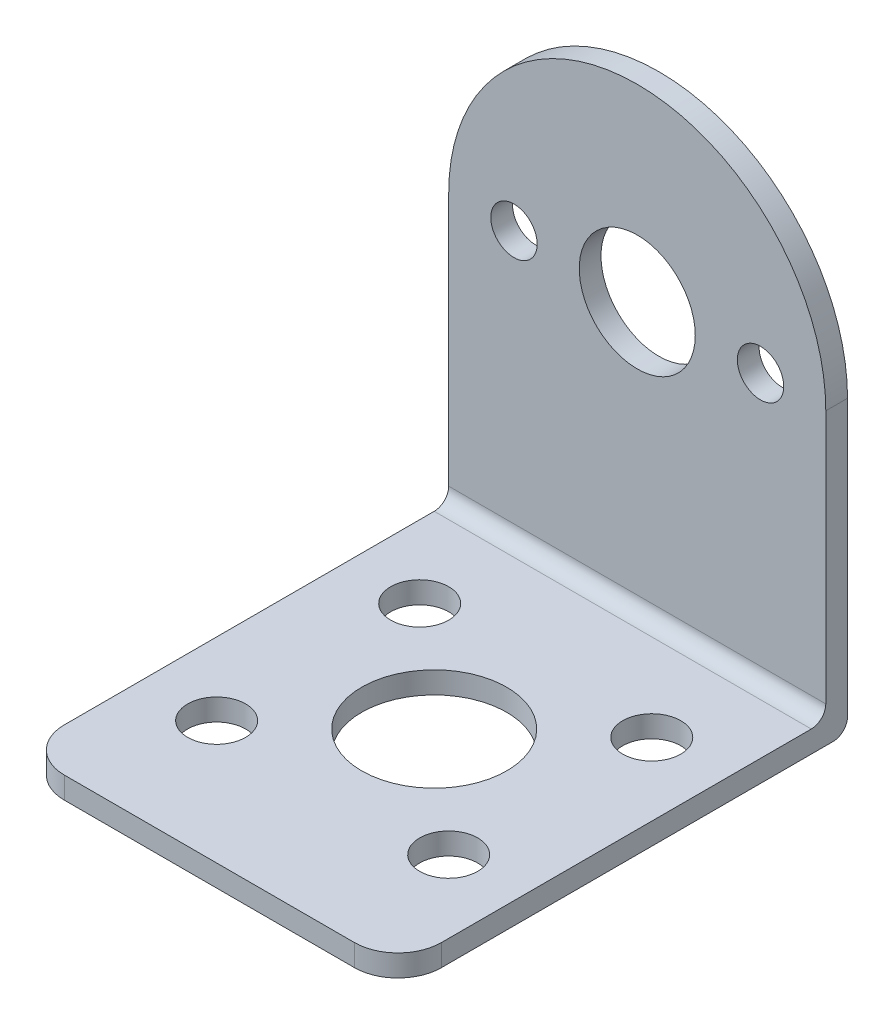
ISO-10303-21;
HEADER;
FILE_DESCRIPTION(('STEP AP214'),'2;1');
FILE_NAME('part.step','',(''),(''),'','','');
FILE_SCHEMA(('AUTOMOTIVE_DESIGN { 1 0 10303 214 1 1 1 1 }'));
ENDSEC;
DATA;
#1=APPLICATION_CONTEXT('core data for automotive mechanical design processes');
#2=APPLICATION_PROTOCOL_DEFINITION('international standard','automotive_design',2000,#1);
#3=PRODUCT_CONTEXT('',#1,'mechanical');
#4=PRODUCT('Part','Part','',(#3));
#5=PRODUCT_RELATED_PRODUCT_CATEGORY('part','',(#4));
#6=PRODUCT_DEFINITION_FORMATION('','',#4);
#7=PRODUCT_DEFINITION_CONTEXT('part definition',#1,'design');
#8=PRODUCT_DEFINITION('design','',#6,#7);
#9=PRODUCT_DEFINITION_SHAPE('','',#8);
#10=(LENGTH_UNIT() NAMED_UNIT(*) SI_UNIT(.MILLI.,.METRE.));
#11=(NAMED_UNIT(*) PLANE_ANGLE_UNIT() SI_UNIT($,.RADIAN.));
#12=(NAMED_UNIT(*) SI_UNIT($,.STERADIAN.) SOLID_ANGLE_UNIT());
#13=UNCERTAINTY_MEASURE_WITH_UNIT(LENGTH_MEASURE(1.E-05),#10,'distance_accuracy_value','');
#14=(GEOMETRIC_REPRESENTATION_CONTEXT(3) GLOBAL_UNCERTAINTY_ASSIGNED_CONTEXT((#13)) GLOBAL_UNIT_ASSIGNED_CONTEXT((#10,
#11,#12)) REPRESENTATION_CONTEXT('',''));
#15=CARTESIAN_POINT('',(0.,0.,0.));
#16=DIRECTION('',(0.,0.,1.));
#17=DIRECTION('',(1.,0.,0.));
#18=AXIS2_PLACEMENT_3D('',#15,#16,#17);
#19=CARTESIAN_POINT('',(-13.,1.5,-15.5));
#20=DIRECTION('',(0.,0.,1.));
#21=DIRECTION('',(1.,0.,0.));
#22=AXIS2_PLACEMENT_3D('',#19,#20,#21);
#23=PLANE('',#22);
#24=CARTESIAN_POINT('',(8.5,20.,-15.5));
#25=DIRECTION('',(0.,0.,1.));
#26=DIRECTION('',(1.,0.,0.));
#27=AXIS2_PLACEMENT_3D('',#24,#25,#26);
#28=CIRCLE('',#27,1.6);
#29=CARTESIAN_POINT('',(10.1,20.,-15.5));
#30=VERTEX_POINT('',#29);
#31=EDGE_CURVE('E311',#30,#30,#28,.T.);
#32=ORIENTED_EDGE('',*,*,#31,.T.);
#33=EDGE_LOOP('',(#32));
#34=FACE_BOUND('',#33,.T.);
#35=CARTESIAN_POINT('',(0.,20.,-15.5));
#36=DIRECTION('',(0.,0.,1.));
#37=DIRECTION('',(1.,0.,0.));
#38=AXIS2_PLACEMENT_3D('',#35,#36,#37);
#39=CIRCLE('',#38,4.);
#40=CARTESIAN_POINT('',(4.,20.,-15.5));
#41=VERTEX_POINT('',#40);
#42=EDGE_CURVE('E305',#41,#41,#39,.T.);
#43=ORIENTED_EDGE('',*,*,#42,.T.);
#44=EDGE_LOOP('',(#43));
#45=FACE_BOUND('',#44,.T.);
#46=DIRECTION('',(0.,-1.,0.));
#47=VECTOR('',#46,1.);
#48=CARTESIAN_POINT('',(13.,1.5,-15.5));
#49=LINE('',#48,#47);
#50=CARTESIAN_POINT('',(13.,20.,-15.5));
#51=VERTEX_POINT('',#50);
#52=CARTESIAN_POINT('',(13.,1.,-15.5));
#53=VERTEX_POINT('',#52);
#54=EDGE_CURVE('E183',#51,#53,#49,.T.);
#55=ORIENTED_EDGE('',*,*,#54,.T.);
#56=DIRECTION('',(-1.,0.,0.));
#57=VECTOR('',#56,1.);
#58=CARTESIAN_POINT('',(-13.,1.,-15.5));
#59=LINE('',#58,#57);
#60=CARTESIAN_POINT('',(-13.,1.,-15.5));
#61=VERTEX_POINT('',#60);
#62=EDGE_CURVE('E205',#53,#61,#59,.T.);
#63=ORIENTED_EDGE('',*,*,#62,.T.);
#64=DIRECTION('',(0.,-1.,0.));
#65=VECTOR('',#64,1.);
#66=CARTESIAN_POINT('',(-13.,1.5,-15.5));
#67=LINE('',#66,#65);
#68=CARTESIAN_POINT('',(-13.,20.,-15.5));
#69=VERTEX_POINT('',#68);
#70=EDGE_CURVE('E186',#69,#61,#67,.T.);
#71=ORIENTED_EDGE('',*,*,#70,.F.);
#72=CARTESIAN_POINT('',(0.,20.,-15.5));
#73=DIRECTION('',(0.,0.,1.));
#74=DIRECTION('',(1.,0.,0.));
#75=AXIS2_PLACEMENT_3D('',#72,#73,#74);
#76=CIRCLE('',#75,13.);
#77=EDGE_CURVE('E178',#51,#69,#76,.T.);
#78=ORIENTED_EDGE('',*,*,#77,.F.);
#79=EDGE_LOOP('',(#55,#63,#71,#78));
#80=FACE_BOUND('',#79,.T.);
#81=CARTESIAN_POINT('',(-8.5,20.,-15.5));
#82=DIRECTION('',(0.,0.,1.));
#83=DIRECTION('',(1.,0.,0.));
#84=AXIS2_PLACEMENT_3D('',#81,#82,#83);
#85=CIRCLE('',#84,1.6);
#86=CARTESIAN_POINT('',(-6.9,20.,-15.5));
#87=VERTEX_POINT('',#86);
#88=EDGE_CURVE('E199',#87,#87,#85,.F.);
#89=ORIENTED_EDGE('',*,*,#88,.F.);
#90=EDGE_LOOP('',(#89));
#91=FACE_BOUND('',#90,.T.);
#92=ADVANCED_FACE('F99',(#34,#45,#80,#91),#23,.F.);
#93=CARTESIAN_POINT('',(-13.,33.,-14.));
#94=DIRECTION('',(0.,0.,-1.));
#95=DIRECTION('',(-1.,0.,0.));
#96=AXIS2_PLACEMENT_3D('',#93,#94,#95);
#97=PLANE('',#96);
#98=CARTESIAN_POINT('',(8.5,20.,-14.));
#99=DIRECTION('',(0.,0.,1.));
#100=DIRECTION('',(1.,0.,0.));
#101=AXIS2_PLACEMENT_3D('',#98,#99,#100);
#102=CIRCLE('',#101,1.6);
#103=CARTESIAN_POINT('',(10.1,20.,-14.));
#104=VERTEX_POINT('',#103);
#105=EDGE_CURVE('E308',#104,#104,#102,.T.);
#106=ORIENTED_EDGE('',*,*,#105,.F.);
#107=EDGE_LOOP('',(#106));
#108=FACE_BOUND('',#107,.T.);
#109=CARTESIAN_POINT('',(0.,20.,-14.));
#110=DIRECTION('',(0.,0.,1.));
#111=DIRECTION('',(1.,0.,0.));
#112=AXIS2_PLACEMENT_3D('',#109,#110,#111);
#113=CIRCLE('',#112,4.);
#114=CARTESIAN_POINT('',(4.,20.,-14.));
#115=VERTEX_POINT('',#114);
#116=EDGE_CURVE('E314',#115,#115,#113,.T.);
#117=ORIENTED_EDGE('',*,*,#116,.F.);
#118=EDGE_LOOP('',(#117));
#119=FACE_BOUND('',#118,.T.);
#120=DIRECTION('',(0.,-1.,0.));
#121=VECTOR('',#120,1.);
#122=CARTESIAN_POINT('',(-13.,33.,-14.));
#123=LINE('',#122,#121);
#124=CARTESIAN_POINT('',(-13.,20.,-14.));
#125=VERTEX_POINT('',#124);
#126=CARTESIAN_POINT('',(-13.,2.5,-14.));
#127=VERTEX_POINT('',#126);
#128=EDGE_CURVE('E293',#125,#127,#123,.T.);
#129=ORIENTED_EDGE('',*,*,#128,.T.);
#130=DIRECTION('',(1.,0.,0.));
#131=VECTOR('',#130,1.);
#132=CARTESIAN_POINT('',(13.,2.5,-14.));
#133=LINE('',#132,#131);
#134=CARTESIAN_POINT('',(13.,2.5,-14.));
#135=VERTEX_POINT('',#134);
#136=EDGE_CURVE('E218',#127,#135,#133,.T.);
#137=ORIENTED_EDGE('',*,*,#136,.T.);
#138=DIRECTION('',(0.,-1.,0.));
#139=VECTOR('',#138,1.);
#140=CARTESIAN_POINT('',(13.,33.,-14.));
#141=LINE('',#140,#139);
#142=CARTESIAN_POINT('',(13.,20.,-14.));
#143=VERTEX_POINT('',#142);
#144=EDGE_CURVE('E298',#143,#135,#141,.T.);
#145=ORIENTED_EDGE('',*,*,#144,.F.);
#146=CARTESIAN_POINT('',(0.,20.,-14.));
#147=DIRECTION('',(0.,0.,1.));
#148=DIRECTION('',(1.,0.,0.));
#149=AXIS2_PLACEMENT_3D('',#146,#147,#148);
#150=CIRCLE('',#149,13.);
#151=EDGE_CURVE('E190',#143,#125,#150,.T.);
#152=ORIENTED_EDGE('',*,*,#151,.T.);
#153=EDGE_LOOP('',(#129,#137,#145,#152));
#154=FACE_BOUND('',#153,.T.);
#155=CARTESIAN_POINT('',(-8.5,20.,-14.));
#156=DIRECTION('',(0.,0.,1.));
#157=DIRECTION('',(1.,0.,0.));
#158=AXIS2_PLACEMENT_3D('',#155,#156,#157);
#159=CIRCLE('',#158,1.6);
#160=CARTESIAN_POINT('',(-6.9,20.,-14.));
#161=VERTEX_POINT('',#160);
#162=EDGE_CURVE('E302',#161,#161,#159,.F.);
#163=ORIENTED_EDGE('',*,*,#162,.T.);
#164=EDGE_LOOP('',(#163));
#165=FACE_BOUND('',#164,.T.);
#166=ADVANCED_FACE('F329',(#108,#119,#154,#165),#97,.F.);
#167=CARTESIAN_POINT('',(-13.,1.5,15.5));
#168=DIRECTION('',(1.,0.,0.));
#169=DIRECTION('',(0.,0.,-1.));
#170=AXIS2_PLACEMENT_3D('',#167,#168,#169);
#171=PLANE('',#170);
#172=DIRECTION('',(0.,0.,1.));
#173=VECTOR('',#172,1.);
#174=CARTESIAN_POINT('',(-13.,0.,15.5));
#175=LINE('',#174,#173);
#176=CARTESIAN_POINT('',(-13.,0.,-14.5));
#177=VERTEX_POINT('',#176);
#178=CARTESIAN_POINT('',(-13.,0.,12.5));
#179=VERTEX_POINT('',#178);
#180=EDGE_CURVE('E259',#177,#179,#175,.T.);
#181=ORIENTED_EDGE('',*,*,#180,.T.);
#182=DIRECTION('',(0.,-1.,0.));
#183=VECTOR('',#182,1.);
#184=CARTESIAN_POINT('',(-13.,1.5,12.5));
#185=LINE('',#184,#183);
#186=CARTESIAN_POINT('',(-13.,1.5,12.5));
#187=VERTEX_POINT('',#186);
#188=EDGE_CURVE('E12',#179,#187,#185,.F.);
#189=ORIENTED_EDGE('',*,*,#188,.T.);
#190=DIRECTION('',(0.,0.,1.));
#191=VECTOR('',#190,1.);
#192=CARTESIAN_POINT('',(-13.,1.5,15.5));
#193=LINE('',#192,#191);
#194=CARTESIAN_POINT('',(-13.,1.5,-13.));
#195=VERTEX_POINT('',#194);
#196=EDGE_CURVE('E248',#195,#187,#193,.T.);
#197=ORIENTED_EDGE('',*,*,#196,.F.);
#198=CARTESIAN_POINT('',(-13.,2.5,-13.));
#199=DIRECTION('',(1.,0.,0.));
#200=DIRECTION('',(0.,0.,-1.));
#201=AXIS2_PLACEMENT_3D('',#198,#199,#200);
#202=CIRCLE('',#201,1.);
#203=EDGE_CURVE('E226',#195,#127,#202,.T.);
#204=ORIENTED_EDGE('',*,*,#203,.T.);
#205=ORIENTED_EDGE('',*,*,#128,.F.);
#206=DIRECTION('',(0.,0.,1.));
#207=VECTOR('',#206,1.);
#208=CARTESIAN_POINT('',(-13.,20.,-15.5));
#209=LINE('',#208,#207);
#210=EDGE_CURVE('E189',#69,#125,#209,.T.);
#211=ORIENTED_EDGE('',*,*,#210,.F.);
#212=ORIENTED_EDGE('',*,*,#70,.T.);
#213=CARTESIAN_POINT('',(-13.,1.,-14.5));
#214=DIRECTION('',(1.,0.,0.));
#215=DIRECTION('',(0.,0.,-1.));
#216=AXIS2_PLACEMENT_3D('',#213,#214,#215);
#217=CIRCLE('',#216,1.);
#218=EDGE_CURVE('E207',#61,#177,#217,.F.);
#219=ORIENTED_EDGE('',*,*,#218,.T.);
#220=EDGE_LOOP('',(#181,#189,#197,#204,#205,#211,#212,#219));
#221=FACE_BOUND('',#220,.T.);
#222=ADVANCED_FACE('F332',(#221),#171,.F.);
#223=CARTESIAN_POINT('',(0.,1.5,0.));
#224=DIRECTION('',(0.,-1.,0.));
#225=DIRECTION('',(0.,0.,-1.));
#226=AXIS2_PLACEMENT_3D('',#223,#224,#225);
#227=PLANE('',#226);
#228=CARTESIAN_POINT('',(8.,1.5,7.));
#229=DIRECTION('',(0.,1.,0.));
#230=DIRECTION('',(0.,0.,1.));
#231=AXIS2_PLACEMENT_3D('',#228,#229,#230);
#232=CIRCLE('',#231,2.);
#233=CARTESIAN_POINT('',(8.,1.5,9.));
#234=VERTEX_POINT('',#233);
#235=EDGE_CURVE('E287',#234,#234,#232,.T.);
#236=ORIENTED_EDGE('',*,*,#235,.F.);
#237=EDGE_LOOP('',(#236));
#238=FACE_BOUND('',#237,.T.);
#239=CARTESIAN_POINT('',(8.,1.5,-7.));
#240=DIRECTION('',(0.,1.,0.));
#241=DIRECTION('',(0.,0.,1.));
#242=AXIS2_PLACEMENT_3D('',#239,#240,#241);
#243=CIRCLE('',#242,2.);
#244=CARTESIAN_POINT('',(8.,1.5,-5.));
#245=VERTEX_POINT('',#244);
#246=EDGE_CURVE('E281',#245,#245,#243,.T.);
#247=ORIENTED_EDGE('',*,*,#246,.F.);
#248=EDGE_LOOP('',(#247));
#249=FACE_BOUND('',#248,.T.);
#250=CARTESIAN_POINT('',(-8.,1.5,7.));
#251=DIRECTION('',(0.,1.,0.));
#252=DIRECTION('',(0.,0.,1.));
#253=AXIS2_PLACEMENT_3D('',#250,#251,#252);
#254=CIRCLE('',#253,2.);
#255=CARTESIAN_POINT('',(-8.,1.5,9.));
#256=VERTEX_POINT('',#255);
#257=EDGE_CURVE('E275',#256,#256,#254,.T.);
#258=ORIENTED_EDGE('',*,*,#257,.F.);
#259=EDGE_LOOP('',(#258));
#260=FACE_BOUND('',#259,.T.);
#261=CARTESIAN_POINT('',(-8.,1.5,-7.));
#262=DIRECTION('',(0.,1.,0.));
#263=DIRECTION('',(0.,0.,1.));
#264=AXIS2_PLACEMENT_3D('',#261,#262,#263);
#265=CIRCLE('',#264,2.);
#266=CARTESIAN_POINT('',(-8.,1.5,-5.));
#267=VERTEX_POINT('',#266);
#268=EDGE_CURVE('E269',#267,#267,#265,.T.);
#269=ORIENTED_EDGE('',*,*,#268,.F.);
#270=EDGE_LOOP('',(#269));
#271=FACE_BOUND('',#270,.T.);
#272=CARTESIAN_POINT('',(0.,1.5,0.));
#273=DIRECTION('',(0.,1.,0.));
#274=DIRECTION('',(0.,0.,1.));
#275=AXIS2_PLACEMENT_3D('',#272,#273,#274);
#276=CIRCLE('',#275,5.);
#277=CARTESIAN_POINT('',(0.,1.5,4.99999999999999));
#278=VERTEX_POINT('',#277);
#279=EDGE_CURVE('E263',#278,#278,#276,.T.);
#280=ORIENTED_EDGE('',*,*,#279,.F.);
#281=EDGE_LOOP('',(#280));
#282=FACE_BOUND('',#281,.T.);
#283=DIRECTION('',(1.,0.,0.));
#284=VECTOR('',#283,1.);
#285=CARTESIAN_POINT('',(-13.,1.5,15.5));
#286=LINE('',#285,#284);
#287=CARTESIAN_POINT('',(-9.99999999999999,1.5,15.5));
#288=VERTEX_POINT('',#287);
#289=CARTESIAN_POINT('',(10.,1.5,15.5));
#290=VERTEX_POINT('',#289);
#291=EDGE_CURVE('E209',#288,#290,#286,.T.);
#292=ORIENTED_EDGE('',*,*,#291,.T.);
#293=CARTESIAN_POINT('',(10.,1.5,12.5));
#294=DIRECTION('',(0.,-1.,0.));
#295=DIRECTION('',(0.,0.,-1.));
#296=AXIS2_PLACEMENT_3D('',#293,#294,#295);
#297=CIRCLE('',#296,3.);
#298=CARTESIAN_POINT('',(13.,1.5,12.5));
#299=VERTEX_POINT('',#298);
#300=EDGE_CURVE('E107',#290,#299,#297,.F.);
#301=ORIENTED_EDGE('',*,*,#300,.T.);
#302=DIRECTION('',(0.,0.,-1.));
#303=VECTOR('',#302,1.);
#304=CARTESIAN_POINT('',(13.,1.5,15.5));
#305=LINE('',#304,#303);
#306=CARTESIAN_POINT('',(13.,1.5,-13.));
#307=VERTEX_POINT('',#306);
#308=EDGE_CURVE('E243',#299,#307,#305,.T.);
#309=ORIENTED_EDGE('',*,*,#308,.T.);
#310=DIRECTION('',(1.,0.,0.));
#311=VECTOR('',#310,1.);
#312=CARTESIAN_POINT('',(-13.,1.5,-13.));
#313=LINE('',#312,#311);
#314=EDGE_CURVE('E221',#307,#195,#313,.F.);
#315=ORIENTED_EDGE('',*,*,#314,.T.);
#316=ORIENTED_EDGE('',*,*,#196,.T.);
#317=CARTESIAN_POINT('',(-9.99999999999999,1.5,12.5));
#318=DIRECTION('',(0.,-1.,0.));
#319=DIRECTION('',(0.,0.,-1.));
#320=AXIS2_PLACEMENT_3D('',#317,#318,#319);
#321=CIRCLE('',#320,3.);
#322=EDGE_CURVE('E239',#187,#288,#321,.F.);
#323=ORIENTED_EDGE('',*,*,#322,.T.);
#324=EDGE_LOOP('',(#292,#301,#309,#315,#316,#323));
#325=FACE_BOUND('',#324,.T.);
#326=ADVANCED_FACE('F242',(#238,#249,#260,#271,#282,#325),#227,.F.);
#327=CARTESIAN_POINT('',(0.,0.,0.));
#328=DIRECTION('',(0.,-1.,0.));
#329=DIRECTION('',(0.,0.,-1.));
#330=AXIS2_PLACEMENT_3D('',#327,#328,#329);
#331=PLANE('',#330);
#332=CARTESIAN_POINT('',(8.,0.,-7.));
#333=DIRECTION('',(0.,1.,0.));
#334=DIRECTION('',(0.,0.,1.));
#335=AXIS2_PLACEMENT_3D('',#332,#333,#334);
#336=CIRCLE('',#335,2.);
#337=CARTESIAN_POINT('',(8.,0.,-5.));
#338=VERTEX_POINT('',#337);
#339=EDGE_CURVE('E284',#338,#338,#336,.T.);
#340=ORIENTED_EDGE('',*,*,#339,.T.);
#341=EDGE_LOOP('',(#340));
#342=FACE_BOUND('',#341,.T.);
#343=CARTESIAN_POINT('',(-8.,0.,-7.));
#344=DIRECTION('',(0.,1.,0.));
#345=DIRECTION('',(0.,0.,1.));
#346=AXIS2_PLACEMENT_3D('',#343,#344,#345);
#347=CIRCLE('',#346,2.);
#348=CARTESIAN_POINT('',(-8.,0.,-5.));
#349=VERTEX_POINT('',#348);
#350=EDGE_CURVE('E272',#349,#349,#347,.T.);
#351=ORIENTED_EDGE('',*,*,#350,.T.);
#352=EDGE_LOOP('',(#351));
#353=FACE_BOUND('',#352,.T.);
#354=DIRECTION('',(0.,0.,-1.));
#355=VECTOR('',#354,1.);
#356=CARTESIAN_POINT('',(13.,0.,15.5));
#357=LINE('',#356,#355);
#358=CARTESIAN_POINT('',(13.,0.,12.5));
#359=VERTEX_POINT('',#358);
#360=CARTESIAN_POINT('',(13.,0.,-14.5));
#361=VERTEX_POINT('',#360);
#362=EDGE_CURVE('E256',#359,#361,#357,.T.);
#363=ORIENTED_EDGE('',*,*,#362,.F.);
#364=CARTESIAN_POINT('',(10.,0.,12.5));
#365=DIRECTION('',(0.,-1.,0.));
#366=DIRECTION('',(0.,0.,-1.));
#367=AXIS2_PLACEMENT_3D('',#364,#365,#366);
#368=CIRCLE('',#367,3.);
#369=CARTESIAN_POINT('',(10.,0.,15.5));
#370=VERTEX_POINT('',#369);
#371=EDGE_CURVE('E233',#359,#370,#368,.T.);
#372=ORIENTED_EDGE('',*,*,#371,.T.);
#373=DIRECTION('',(1.,0.,0.));
#374=VECTOR('',#373,1.);
#375=CARTESIAN_POINT('',(-13.,0.,15.5));
#376=LINE('',#375,#374);
#377=CARTESIAN_POINT('',(-9.99999999999999,0.,15.5));
#378=VERTEX_POINT('',#377);
#379=EDGE_CURVE('E249',#378,#370,#376,.T.);
#380=ORIENTED_EDGE('',*,*,#379,.F.);
#381=CARTESIAN_POINT('',(-9.99999999999999,0.,12.5));
#382=DIRECTION('',(0.,-1.,0.));
#383=DIRECTION('',(0.,0.,-1.));
#384=AXIS2_PLACEMENT_3D('',#381,#382,#383);
#385=CIRCLE('',#384,3.);
#386=EDGE_CURVE('E231',#378,#179,#385,.T.);
#387=ORIENTED_EDGE('',*,*,#386,.T.);
#388=ORIENTED_EDGE('',*,*,#180,.F.);
#389=DIRECTION('',(-1.,0.,0.));
#390=VECTOR('',#389,1.);
#391=CARTESIAN_POINT('',(13.,0.,-14.5));
#392=LINE('',#391,#390);
#393=EDGE_CURVE('E214',#177,#361,#392,.F.);
#394=ORIENTED_EDGE('',*,*,#393,.T.);
#395=EDGE_LOOP('',(#363,#372,#380,#387,#388,#394));
#396=FACE_BOUND('',#395,.T.);
#397=CARTESIAN_POINT('',(0.,0.,0.));
#398=DIRECTION('',(0.,1.,0.));
#399=DIRECTION('',(0.,0.,1.));
#400=AXIS2_PLACEMENT_3D('',#397,#398,#399);
#401=CIRCLE('',#400,5.);
#402=CARTESIAN_POINT('',(0.,0.,4.99999999999999));
#403=VERTEX_POINT('',#402);
#404=EDGE_CURVE('E266',#403,#403,#401,.T.);
#405=ORIENTED_EDGE('',*,*,#404,.T.);
#406=EDGE_LOOP('',(#405));
#407=FACE_BOUND('',#406,.T.);
#408=CARTESIAN_POINT('',(-8.,0.,7.));
#409=DIRECTION('',(0.,1.,0.));
#410=DIRECTION('',(0.,0.,1.));
#411=AXIS2_PLACEMENT_3D('',#408,#409,#410);
#412=CIRCLE('',#411,2.);
#413=CARTESIAN_POINT('',(-8.,0.,9.));
#414=VERTEX_POINT('',#413);
#415=EDGE_CURVE('E278',#414,#414,#412,.T.);
#416=ORIENTED_EDGE('',*,*,#415,.T.);
#417=EDGE_LOOP('',(#416));
#418=FACE_BOUND('',#417,.T.);
#419=CARTESIAN_POINT('',(8.,0.,7.));
#420=DIRECTION('',(0.,1.,0.));
#421=DIRECTION('',(0.,0.,1.));
#422=AXIS2_PLACEMENT_3D('',#419,#420,#421);
#423=CIRCLE('',#422,2.);
#424=CARTESIAN_POINT('',(8.,0.,9.));
#425=VERTEX_POINT('',#424);
#426=EDGE_CURVE('E290',#425,#425,#423,.T.);
#427=ORIENTED_EDGE('',*,*,#426,.T.);
#428=EDGE_LOOP('',(#427));
#429=FACE_BOUND('',#428,.T.);
#430=ADVANCED_FACE('F254',(#342,#353,#396,#407,#418,#429),#331,.T.);
#431=CARTESIAN_POINT('',(13.,1.5,15.5));
#432=DIRECTION('',(-1.,0.,0.));
#433=DIRECTION('',(0.,0.,1.));
#434=AXIS2_PLACEMENT_3D('',#431,#432,#433);
#435=PLANE('',#434);
#436=ORIENTED_EDGE('',*,*,#308,.F.);
#437=DIRECTION('',(0.,-1.,0.));
#438=VECTOR('',#437,1.);
#439=CARTESIAN_POINT('',(13.,1.5,12.5));
#440=LINE('',#439,#438);
#441=EDGE_CURVE('E228',#299,#359,#440,.T.);
#442=ORIENTED_EDGE('',*,*,#441,.T.);
#443=ORIENTED_EDGE('',*,*,#362,.T.);
#444=CARTESIAN_POINT('',(13.,1.,-14.5));
#445=DIRECTION('',(-1.,0.,0.));
#446=DIRECTION('',(0.,0.,1.));
#447=AXIS2_PLACEMENT_3D('',#444,#445,#446);
#448=CIRCLE('',#447,1.);
#449=EDGE_CURVE('E204',#361,#53,#448,.F.);
#450=ORIENTED_EDGE('',*,*,#449,.T.);
#451=ORIENTED_EDGE('',*,*,#54,.F.);
#452=DIRECTION('',(0.,0.,1.));
#453=VECTOR('',#452,1.);
#454=CARTESIAN_POINT('',(13.,20.,-15.5));
#455=LINE('',#454,#453);
#456=EDGE_CURVE('E193',#51,#143,#455,.T.);
#457=ORIENTED_EDGE('',*,*,#456,.T.);
#458=ORIENTED_EDGE('',*,*,#144,.T.);
#459=CARTESIAN_POINT('',(13.,2.5,-13.));
#460=DIRECTION('',(-1.,0.,0.));
#461=DIRECTION('',(0.,0.,1.));
#462=AXIS2_PLACEMENT_3D('',#459,#460,#461);
#463=CIRCLE('',#462,1.);
#464=EDGE_CURVE('E223',#135,#307,#463,.T.);
#465=ORIENTED_EDGE('',*,*,#464,.T.);
#466=EDGE_LOOP('',(#436,#442,#443,#450,#451,#457,#458,#465));
#467=FACE_BOUND('',#466,.T.);
#468=ADVANCED_FACE('F202',(#467),#435,.F.);
#469=CARTESIAN_POINT('',(-13.,1.5,15.5));
#470=DIRECTION('',(0.,0.,-1.));
#471=DIRECTION('',(-1.,0.,0.));
#472=AXIS2_PLACEMENT_3D('',#469,#470,#471);
#473=PLANE('',#472);
#474=ORIENTED_EDGE('',*,*,#379,.T.);
#475=DIRECTION('',(0.,-1.,0.));
#476=VECTOR('',#475,1.);
#477=CARTESIAN_POINT('',(10.,1.5,15.5));
#478=LINE('',#477,#476);
#479=EDGE_CURVE('E120',#370,#290,#478,.F.);
#480=ORIENTED_EDGE('',*,*,#479,.T.);
#481=ORIENTED_EDGE('',*,*,#291,.F.);
#482=DIRECTION('',(0.,-1.,0.));
#483=VECTOR('',#482,1.);
#484=CARTESIAN_POINT('',(-9.99999999999999,1.5,15.5));
#485=LINE('',#484,#483);
#486=EDGE_CURVE('E235',#288,#378,#485,.T.);
#487=ORIENTED_EDGE('',*,*,#486,.T.);
#488=EDGE_LOOP('',(#474,#480,#481,#487));
#489=FACE_BOUND('',#488,.T.);
#490=ADVANCED_FACE('F257',(#489),#473,.F.);
#491=CARTESIAN_POINT('',(0.,1.5,0.));
#492=DIRECTION('',(0.,-1.,0.));
#493=DIRECTION('',(0.,0.,-1.));
#494=AXIS2_PLACEMENT_3D('',#491,#492,#493);
#495=CYLINDRICAL_SURFACE('',#494,5.);
#496=ORIENTED_EDGE('',*,*,#279,.T.);
#497=EDGE_LOOP('',(#496));
#498=FACE_BOUND('',#497,.T.);
#499=ORIENTED_EDGE('',*,*,#404,.F.);
#500=EDGE_LOOP('',(#499));
#501=FACE_BOUND('',#500,.T.);
#502=ADVANCED_FACE('F391',(#498,#501),#495,.F.);
#503=CARTESIAN_POINT('',(-8.,1.5,-7.));
#504=DIRECTION('',(0.,-1.,0.));
#505=DIRECTION('',(0.,0.,-1.));
#506=AXIS2_PLACEMENT_3D('',#503,#504,#505);
#507=CYLINDRICAL_SURFACE('',#506,2.);
#508=ORIENTED_EDGE('',*,*,#268,.T.);
#509=EDGE_LOOP('',(#508));
#510=FACE_BOUND('',#509,.T.);
#511=ORIENTED_EDGE('',*,*,#350,.F.);
#512=EDGE_LOOP('',(#511));
#513=FACE_BOUND('',#512,.T.);
#514=ADVANCED_FACE('F397',(#510,#513),#507,.F.);
#515=CARTESIAN_POINT('',(-8.,1.5,7.));
#516=DIRECTION('',(0.,-1.,0.));
#517=DIRECTION('',(0.,0.,-1.));
#518=AXIS2_PLACEMENT_3D('',#515,#516,#517);
#519=CYLINDRICAL_SURFACE('',#518,2.);
#520=ORIENTED_EDGE('',*,*,#257,.T.);
#521=EDGE_LOOP('',(#520));
#522=FACE_BOUND('',#521,.T.);
#523=ORIENTED_EDGE('',*,*,#415,.F.);
#524=EDGE_LOOP('',(#523));
#525=FACE_BOUND('',#524,.T.);
#526=ADVANCED_FACE('F402',(#522,#525),#519,.F.);
#527=CARTESIAN_POINT('',(8.,1.5,-7.));
#528=DIRECTION('',(0.,-1.,0.));
#529=DIRECTION('',(0.,0.,-1.));
#530=AXIS2_PLACEMENT_3D('',#527,#528,#529);
#531=CYLINDRICAL_SURFACE('',#530,2.);
#532=ORIENTED_EDGE('',*,*,#246,.T.);
#533=EDGE_LOOP('',(#532));
#534=FACE_BOUND('',#533,.T.);
#535=ORIENTED_EDGE('',*,*,#339,.F.);
#536=EDGE_LOOP('',(#535));
#537=FACE_BOUND('',#536,.T.);
#538=ADVANCED_FACE('F413',(#534,#537),#531,.F.);
#539=CARTESIAN_POINT('',(8.,1.5,7.));
#540=DIRECTION('',(0.,-1.,0.));
#541=DIRECTION('',(0.,0.,-1.));
#542=AXIS2_PLACEMENT_3D('',#539,#540,#541);
#543=CYLINDRICAL_SURFACE('',#542,2.);
#544=ORIENTED_EDGE('',*,*,#235,.T.);
#545=EDGE_LOOP('',(#544));
#546=FACE_BOUND('',#545,.T.);
#547=ORIENTED_EDGE('',*,*,#426,.F.);
#548=EDGE_LOOP('',(#547));
#549=FACE_BOUND('',#548,.T.);
#550=ADVANCED_FACE('F346',(#546,#549),#543,.F.);
#551=CARTESIAN_POINT('',(0.,20.,-15.5));
#552=DIRECTION('',(0.,0.,1.));
#553=DIRECTION('',(1.,0.,0.));
#554=AXIS2_PLACEMENT_3D('',#551,#552,#553);
#555=CYLINDRICAL_SURFACE('',#554,13.);
#556=ORIENTED_EDGE('',*,*,#151,.F.);
#557=ORIENTED_EDGE('',*,*,#456,.F.);
#558=ORIENTED_EDGE('',*,*,#77,.T.);
#559=ORIENTED_EDGE('',*,*,#210,.T.);
#560=EDGE_LOOP('',(#556,#557,#558,#559));
#561=FACE_BOUND('',#560,.T.);
#562=ADVANCED_FACE('F194',(#561),#555,.T.);
#563=CARTESIAN_POINT('',(-8.5,20.,-15.5));
#564=DIRECTION('',(0.,0.,1.));
#565=DIRECTION('',(1.,0.,0.));
#566=AXIS2_PLACEMENT_3D('',#563,#564,#565);
#567=CYLINDRICAL_SURFACE('',#566,1.6);
#568=ORIENTED_EDGE('',*,*,#88,.T.);
#569=EDGE_LOOP('',(#568));
#570=FACE_BOUND('',#569,.T.);
#571=ORIENTED_EDGE('',*,*,#162,.F.);
#572=EDGE_LOOP('',(#571));
#573=FACE_BOUND('',#572,.T.);
#574=ADVANCED_FACE('F325',(#570,#573),#567,.F.);
#575=CARTESIAN_POINT('',(0.,20.,-15.5));
#576=DIRECTION('',(0.,0.,1.));
#577=DIRECTION('',(1.,0.,0.));
#578=AXIS2_PLACEMENT_3D('',#575,#576,#577);
#579=CYLINDRICAL_SURFACE('',#578,4.);
#580=ORIENTED_EDGE('',*,*,#42,.F.);
#581=EDGE_LOOP('',(#580));
#582=FACE_BOUND('',#581,.T.);
#583=ORIENTED_EDGE('',*,*,#116,.T.);
#584=EDGE_LOOP('',(#583));
#585=FACE_BOUND('',#584,.T.);
#586=ADVANCED_FACE('F321',(#582,#585),#579,.F.);
#587=CARTESIAN_POINT('',(8.5,20.,-15.5));
#588=DIRECTION('',(0.,0.,1.));
#589=DIRECTION('',(1.,0.,0.));
#590=AXIS2_PLACEMENT_3D('',#587,#588,#589);
#591=CYLINDRICAL_SURFACE('',#590,1.6);
#592=ORIENTED_EDGE('',*,*,#31,.F.);
#593=EDGE_LOOP('',(#592));
#594=FACE_BOUND('',#593,.T.);
#595=ORIENTED_EDGE('',*,*,#105,.T.);
#596=EDGE_LOOP('',(#595));
#597=FACE_BOUND('',#596,.T.);
#598=ADVANCED_FACE('F324',(#594,#597),#591,.F.);
#599=CARTESIAN_POINT('',(-13.,1.,-14.5));
#600=DIRECTION('',(1.,0.,0.));
#601=DIRECTION('',(0.,0.,-1.));
#602=AXIS2_PLACEMENT_3D('',#599,#600,#601);
#603=CYLINDRICAL_SURFACE('',#602,1.);
#604=ORIENTED_EDGE('',*,*,#449,.F.);
#605=ORIENTED_EDGE('',*,*,#393,.F.);
#606=ORIENTED_EDGE('',*,*,#218,.F.);
#607=ORIENTED_EDGE('',*,*,#62,.F.);
#608=EDGE_LOOP('',(#604,#605,#606,#607));
#609=FACE_BOUND('',#608,.T.);
#610=ADVANCED_FACE('F359',(#609),#603,.T.);
#611=CARTESIAN_POINT('',(-13.,2.5,-13.));
#612=DIRECTION('',(-1.,0.,0.));
#613=DIRECTION('',(0.,0.,1.));
#614=AXIS2_PLACEMENT_3D('',#611,#612,#613);
#615=CYLINDRICAL_SURFACE('',#614,1.);
#616=ORIENTED_EDGE('',*,*,#203,.F.);
#617=ORIENTED_EDGE('',*,*,#314,.F.);
#618=ORIENTED_EDGE('',*,*,#464,.F.);
#619=ORIENTED_EDGE('',*,*,#136,.F.);
#620=EDGE_LOOP('',(#616,#617,#618,#619));
#621=FACE_BOUND('',#620,.T.);
#622=ADVANCED_FACE('F362',(#621),#615,.F.);
#623=CARTESIAN_POINT('',(10.,1.5,12.5));
#624=DIRECTION('',(0.,-1.,0.));
#625=DIRECTION('',(0.,0.,-1.));
#626=AXIS2_PLACEMENT_3D('',#623,#624,#625);
#627=CYLINDRICAL_SURFACE('',#626,3.);
#628=ORIENTED_EDGE('',*,*,#300,.F.);
#629=ORIENTED_EDGE('',*,*,#479,.F.);
#630=ORIENTED_EDGE('',*,*,#371,.F.);
#631=ORIENTED_EDGE('',*,*,#441,.F.);
#632=EDGE_LOOP('',(#628,#629,#630,#631));
#633=FACE_BOUND('',#632,.T.);
#634=ADVANCED_FACE('F251',(#633),#627,.T.);
#635=CARTESIAN_POINT('',(-9.99999999999999,1.5,12.5));
#636=DIRECTION('',(0.,-1.,0.));
#637=DIRECTION('',(0.,0.,-1.));
#638=AXIS2_PLACEMENT_3D('',#635,#636,#637);
#639=CYLINDRICAL_SURFACE('',#638,3.);
#640=ORIENTED_EDGE('',*,*,#322,.F.);
#641=ORIENTED_EDGE('',*,*,#188,.F.);
#642=ORIENTED_EDGE('',*,*,#386,.F.);
#643=ORIENTED_EDGE('',*,*,#486,.F.);
#644=EDGE_LOOP('',(#640,#641,#642,#643));
#645=FACE_BOUND('',#644,.T.);
#646=ADVANCED_FACE('F101',(#645),#639,.T.);
#647=CLOSED_SHELL('',(#92,#166,#222,#326,#430,#468,#490,#502,#514,#526,#538,#550,#562,#574,#586,
#598,#610,#622,#634,#646));
#648=MANIFOLD_SOLID_BREP('B2',#647);
#649=ADVANCED_BREP_SHAPE_REPRESENTATION('',(#18,#648),#14);
#650=SHAPE_DEFINITION_REPRESENTATION(#9,#649);
ENDSEC;
END-ISO-10303-21;
